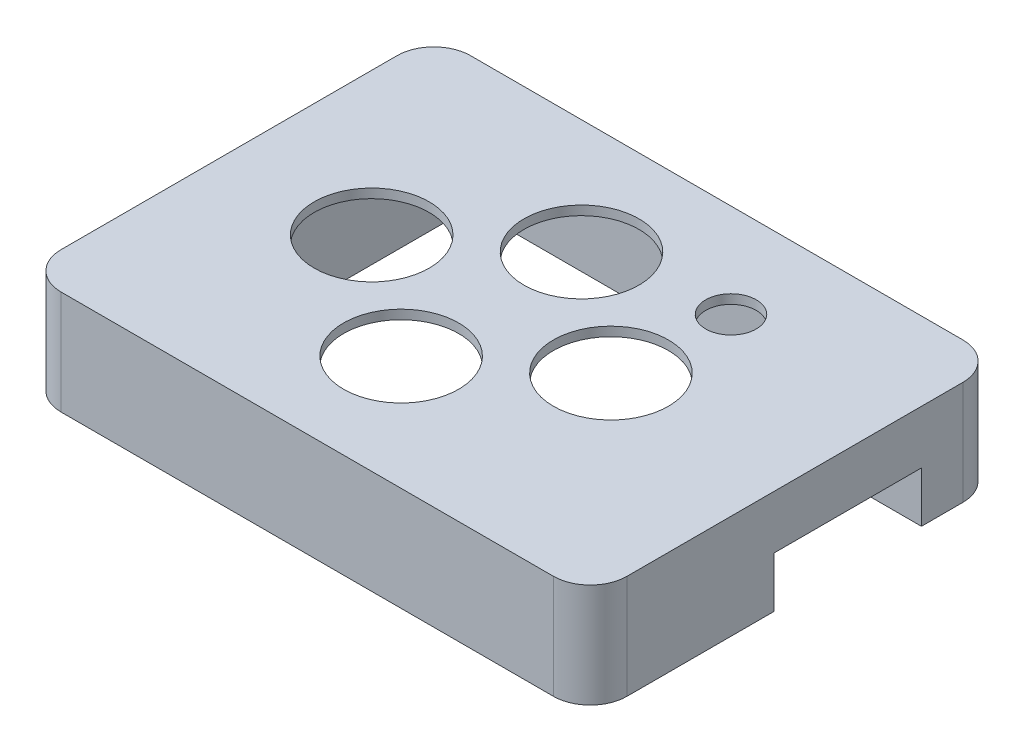
ISO-10303-21;
HEADER;
FILE_DESCRIPTION(('STEP AP214'),'2;1');
FILE_NAME('part.step','',(''),(''),'','','');
FILE_SCHEMA(('AUTOMOTIVE_DESIGN { 1 0 10303 214 1 1 1 1 }'));
ENDSEC;
DATA;
#1=APPLICATION_CONTEXT('core data for automotive mechanical design processes');
#2=APPLICATION_PROTOCOL_DEFINITION('international standard','automotive_design',2000,#1);
#3=PRODUCT_CONTEXT('',#1,'mechanical');
#4=PRODUCT('Part','Part','',(#3));
#5=PRODUCT_RELATED_PRODUCT_CATEGORY('part','',(#4));
#6=PRODUCT_DEFINITION_FORMATION('','',#4);
#7=PRODUCT_DEFINITION_CONTEXT('part definition',#1,'design');
#8=PRODUCT_DEFINITION('design','',#6,#7);
#9=PRODUCT_DEFINITION_SHAPE('','',#8);
#10=(LENGTH_UNIT() NAMED_UNIT(*) SI_UNIT(.MILLI.,.METRE.));
#11=(NAMED_UNIT(*) PLANE_ANGLE_UNIT() SI_UNIT($,.RADIAN.));
#12=(NAMED_UNIT(*) SI_UNIT($,.STERADIAN.) SOLID_ANGLE_UNIT());
#13=UNCERTAINTY_MEASURE_WITH_UNIT(LENGTH_MEASURE(1.E-05),#10,'distance_accuracy_value','');
#14=(GEOMETRIC_REPRESENTATION_CONTEXT(3) GLOBAL_UNCERTAINTY_ASSIGNED_CONTEXT((#13)) GLOBAL_UNIT_ASSIGNED_CONTEXT((#10,
#11,#12)) REPRESENTATION_CONTEXT('',''));
#15=CARTESIAN_POINT('',(0.,0.,0.));
#16=DIRECTION('',(0.,0.,1.));
#17=DIRECTION('',(1.,0.,0.));
#18=AXIS2_PLACEMENT_3D('',#15,#16,#17);
#19=CARTESIAN_POINT('',(0.,1.,0.));
#20=DIRECTION('',(0.,1.,0.));
#21=DIRECTION('',(0.,0.,1.));
#22=AXIS2_PLACEMENT_3D('',#19,#20,#21);
#23=PLANE('',#22);
#24=CARTESIAN_POINT('',(-2.24999999999999,1.,9.8));
#25=DIRECTION('',(0.,1.,0.));
#26=DIRECTION('',(0.,0.,1.));
#27=AXIS2_PLACEMENT_3D('',#24,#25,#26);
#28=CIRCLE('',#27,6.25);
#29=CARTESIAN_POINT('',(-2.24999999999999,1.,16.05));
#30=VERTEX_POINT('',#29);
#31=EDGE_CURVE('E255',#30,#30,#28,.T.);
#32=ORIENTED_EDGE('',*,*,#31,.F.);
#33=EDGE_LOOP('',(#32));
#34=FACE_BOUND('',#33,.T.);
#35=CARTESIAN_POINT('',(10.75,1.,0.));
#36=DIRECTION('',(0.,1.,0.));
#37=DIRECTION('',(0.,0.,1.));
#38=AXIS2_PLACEMENT_3D('',#35,#36,#37);
#39=CIRCLE('',#38,6.25);
#40=CARTESIAN_POINT('',(10.75,1.,6.25));
#41=VERTEX_POINT('',#40);
#42=EDGE_CURVE('E267',#41,#41,#39,.T.);
#43=ORIENTED_EDGE('',*,*,#42,.F.);
#44=EDGE_LOOP('',(#43));
#45=FACE_BOUND('',#44,.T.);
#46=CARTESIAN_POINT('',(-2.24999999999999,1.,-9.8));
#47=DIRECTION('',(0.,1.,0.));
#48=DIRECTION('',(0.,0.,1.));
#49=AXIS2_PLACEMENT_3D('',#46,#47,#48);
#50=CIRCLE('',#49,6.25);
#51=CARTESIAN_POINT('',(-2.24999999999999,1.,-3.55));
#52=VERTEX_POINT('',#51);
#53=EDGE_CURVE('E273',#52,#52,#50,.T.);
#54=ORIENTED_EDGE('',*,*,#53,.F.);
#55=EDGE_LOOP('',(#54));
#56=FACE_BOUND('',#55,.T.);
#57=CARTESIAN_POINT('',(-15.25,1.,0.));
#58=DIRECTION('',(0.,1.,0.));
#59=DIRECTION('',(0.,0.,1.));
#60=AXIS2_PLACEMENT_3D('',#57,#58,#59);
#61=CIRCLE('',#60,6.25);
#62=CARTESIAN_POINT('',(-15.25,1.,6.25));
#63=VERTEX_POINT('',#62);
#64=EDGE_CURVE('E261',#63,#63,#61,.T.);
#65=ORIENTED_EDGE('',*,*,#64,.F.);
#66=EDGE_LOOP('',(#65));
#67=FACE_BOUND('',#66,.T.);
#68=CARTESIAN_POINT('',(11.75,1.,-12.05));
#69=DIRECTION('',(0.,1.,0.));
#70=DIRECTION('',(0.,0.,1.));
#71=AXIS2_PLACEMENT_3D('',#68,#69,#70);
#72=CIRCLE('',#71,2.75);
#73=CARTESIAN_POINT('',(11.75,1.,-9.3));
#74=VERTEX_POINT('',#73);
#75=EDGE_CURVE('E249',#74,#74,#72,.T.);
#76=ORIENTED_EDGE('',*,*,#75,.F.);
#77=EDGE_LOOP('',(#76));
#78=FACE_BOUND('',#77,.T.);
#79=DIRECTION('',(0.,0.,1.));
#80=VECTOR('',#79,1.);
#81=CARTESIAN_POINT('',(-30.75,1.,22.25));
#82=LINE('',#81,#80);
#83=CARTESIAN_POINT('',(-30.75,1.,-18.25));
#84=VERTEX_POINT('',#83);
#85=CARTESIAN_POINT('',(-30.75,1.,18.25));
#86=VERTEX_POINT('',#85);
#87=EDGE_CURVE('E216',#84,#86,#82,.T.);
#88=ORIENTED_EDGE('',*,*,#87,.T.);
#89=CARTESIAN_POINT('',(-26.75,1.,18.25));
#90=DIRECTION('',(0.,1.,0.));
#91=DIRECTION('',(0.,0.,1.));
#92=AXIS2_PLACEMENT_3D('',#89,#90,#91);
#93=CIRCLE('',#92,4.);
#94=CARTESIAN_POINT('',(-26.75,1.,22.25));
#95=VERTEX_POINT('',#94);
#96=EDGE_CURVE('E301',#86,#95,#93,.T.);
#97=ORIENTED_EDGE('',*,*,#96,.T.);
#98=DIRECTION('',(1.,0.,0.));
#99=VECTOR('',#98,1.);
#100=CARTESIAN_POINT('',(30.75,1.,22.25));
#101=LINE('',#100,#99);
#102=CARTESIAN_POINT('',(26.75,1.,22.25));
#103=VERTEX_POINT('',#102);
#104=EDGE_CURVE('E241',#95,#103,#101,.T.);
#105=ORIENTED_EDGE('',*,*,#104,.T.);
#106=CARTESIAN_POINT('',(26.75,1.,18.25));
#107=DIRECTION('',(0.,1.,0.));
#108=DIRECTION('',(0.,0.,1.));
#109=AXIS2_PLACEMENT_3D('',#106,#107,#108);
#110=CIRCLE('',#109,4.);
#111=CARTESIAN_POINT('',(30.75,1.,18.25));
#112=VERTEX_POINT('',#111);
#113=EDGE_CURVE('E295',#103,#112,#110,.T.);
#114=ORIENTED_EDGE('',*,*,#113,.T.);
#115=DIRECTION('',(0.,0.,-1.));
#116=VECTOR('',#115,1.);
#117=CARTESIAN_POINT('',(30.75,1.,22.25));
#118=LINE('',#117,#116);
#119=CARTESIAN_POINT('',(30.75,1.,-18.25));
#120=VERTEX_POINT('',#119);
#121=EDGE_CURVE('E244',#112,#120,#118,.T.);
#122=ORIENTED_EDGE('',*,*,#121,.T.);
#123=CARTESIAN_POINT('',(26.75,1.,-18.25));
#124=DIRECTION('',(0.,1.,0.));
#125=DIRECTION('',(0.,0.,1.));
#126=AXIS2_PLACEMENT_3D('',#123,#124,#125);
#127=CIRCLE('',#126,4.);
#128=CARTESIAN_POINT('',(26.75,1.,-22.25));
#129=VERTEX_POINT('',#128);
#130=EDGE_CURVE('E297',#120,#129,#127,.T.);
#131=ORIENTED_EDGE('',*,*,#130,.T.);
#132=DIRECTION('',(-1.,0.,0.));
#133=VECTOR('',#132,1.);
#134=CARTESIAN_POINT('',(30.75,1.,-22.25));
#135=LINE('',#134,#133);
#136=CARTESIAN_POINT('',(-26.75,1.,-22.25));
#137=VERTEX_POINT('',#136);
#138=EDGE_CURVE('E229',#129,#137,#135,.T.);
#139=ORIENTED_EDGE('',*,*,#138,.T.);
#140=CARTESIAN_POINT('',(-26.75,1.,-18.25));
#141=DIRECTION('',(0.,1.,0.));
#142=DIRECTION('',(0.,0.,1.));
#143=AXIS2_PLACEMENT_3D('',#140,#141,#142);
#144=CIRCLE('',#143,4.);
#145=EDGE_CURVE('E299',#137,#84,#144,.T.);
#146=ORIENTED_EDGE('',*,*,#145,.T.);
#147=EDGE_LOOP('',(#88,#97,#105,#114,#122,#131,#139,#146));
#148=FACE_BOUND('',#147,.T.);
#149=ADVANCED_FACE('F34',(#34,#45,#56,#67,#78,#148),#23,.T.);
#150=CARTESIAN_POINT('',(0.,0.,0.));
#151=DIRECTION('',(0.,1.,0.));
#152=DIRECTION('',(0.,0.,1.));
#153=AXIS2_PLACEMENT_3D('',#150,#151,#152);
#154=PLANE('',#153);
#155=DIRECTION('',(0.,0.,1.));
#156=VECTOR('',#155,1.);
#157=CARTESIAN_POINT('',(-23.75,0.,19.25));
#158=LINE('',#157,#156);
#159=CARTESIAN_POINT('',(-23.75,0.,-19.25));
#160=VERTEX_POINT('',#159);
#161=CARTESIAN_POINT('',(-23.75,0.,19.25));
#162=VERTEX_POINT('',#161);
#163=EDGE_CURVE('E276',#160,#162,#158,.T.);
#164=ORIENTED_EDGE('',*,*,#163,.F.);
#165=DIRECTION('',(-1.,0.,0.));
#166=VECTOR('',#165,1.);
#167=CARTESIAN_POINT('',(23.75,0.,-19.25));
#168=LINE('',#167,#166);
#169=CARTESIAN_POINT('',(23.75,0.,-19.25));
#170=VERTEX_POINT('',#169);
#171=EDGE_CURVE('E287',#170,#160,#168,.T.);
#172=ORIENTED_EDGE('',*,*,#171,.F.);
#173=DIRECTION('',(0.,0.,-1.));
#174=VECTOR('',#173,1.);
#175=CARTESIAN_POINT('',(23.75,0.,19.25));
#176=LINE('',#175,#174);
#177=CARTESIAN_POINT('',(23.75,0.,19.25));
#178=VERTEX_POINT('',#177);
#179=EDGE_CURVE('E284',#178,#170,#176,.T.);
#180=ORIENTED_EDGE('',*,*,#179,.F.);
#181=DIRECTION('',(1.,0.,0.));
#182=VECTOR('',#181,1.);
#183=CARTESIAN_POINT('',(23.75,0.,19.25));
#184=LINE('',#183,#182);
#185=EDGE_CURVE('E281',#162,#178,#184,.T.);
#186=ORIENTED_EDGE('',*,*,#185,.F.);
#187=EDGE_LOOP('',(#164,#172,#180,#186));
#188=FACE_BOUND('',#187,.T.);
#189=CARTESIAN_POINT('',(-2.24999999999999,0.,-9.8));
#190=DIRECTION('',(0.,1.,0.));
#191=DIRECTION('',(0.,0.,1.));
#192=AXIS2_PLACEMENT_3D('',#189,#190,#191);
#193=CIRCLE('',#192,6.25);
#194=CARTESIAN_POINT('',(-2.24999999999999,0.,-3.55));
#195=VERTEX_POINT('',#194);
#196=EDGE_CURVE('E270',#195,#195,#193,.T.);
#197=ORIENTED_EDGE('',*,*,#196,.T.);
#198=EDGE_LOOP('',(#197));
#199=FACE_BOUND('',#198,.T.);
#200=CARTESIAN_POINT('',(10.75,0.,0.));
#201=DIRECTION('',(0.,1.,0.));
#202=DIRECTION('',(0.,0.,1.));
#203=AXIS2_PLACEMENT_3D('',#200,#201,#202);
#204=CIRCLE('',#203,6.25);
#205=CARTESIAN_POINT('',(10.75,0.,6.25));
#206=VERTEX_POINT('',#205);
#207=EDGE_CURVE('E264',#206,#206,#204,.T.);
#208=ORIENTED_EDGE('',*,*,#207,.T.);
#209=EDGE_LOOP('',(#208));
#210=FACE_BOUND('',#209,.T.);
#211=CARTESIAN_POINT('',(-15.25,0.,0.));
#212=DIRECTION('',(0.,1.,0.));
#213=DIRECTION('',(0.,0.,1.));
#214=AXIS2_PLACEMENT_3D('',#211,#212,#213);
#215=CIRCLE('',#214,6.25);
#216=CARTESIAN_POINT('',(-15.25,0.,6.25));
#217=VERTEX_POINT('',#216);
#218=EDGE_CURVE('E258',#217,#217,#215,.T.);
#219=ORIENTED_EDGE('',*,*,#218,.T.);
#220=EDGE_LOOP('',(#219));
#221=FACE_BOUND('',#220,.T.);
#222=CARTESIAN_POINT('',(-2.24999999999999,0.,9.8));
#223=DIRECTION('',(0.,1.,0.));
#224=DIRECTION('',(0.,0.,1.));
#225=AXIS2_PLACEMENT_3D('',#222,#223,#224);
#226=CIRCLE('',#225,6.25);
#227=CARTESIAN_POINT('',(-2.24999999999999,0.,16.05));
#228=VERTEX_POINT('',#227);
#229=EDGE_CURVE('E252',#228,#228,#226,.T.);
#230=ORIENTED_EDGE('',*,*,#229,.T.);
#231=EDGE_LOOP('',(#230));
#232=FACE_BOUND('',#231,.T.);
#233=CARTESIAN_POINT('',(11.75,0.,-12.05));
#234=DIRECTION('',(0.,1.,0.));
#235=DIRECTION('',(0.,0.,1.));
#236=AXIS2_PLACEMENT_3D('',#233,#234,#235);
#237=CIRCLE('',#236,2.75);
#238=CARTESIAN_POINT('',(11.75,0.,-9.3));
#239=VERTEX_POINT('',#238);
#240=EDGE_CURVE('E238',#239,#239,#237,.T.);
#241=ORIENTED_EDGE('',*,*,#240,.T.);
#242=EDGE_LOOP('',(#241));
#243=FACE_BOUND('',#242,.T.);
#244=ADVANCED_FACE('F374',(#188,#199,#210,#221,#232,#243),#154,.F.);
#245=CARTESIAN_POINT('',(-2.24999999999999,1.,-9.8));
#246=DIRECTION('',(0.,-1.,0.));
#247=DIRECTION('',(0.,0.,-1.));
#248=AXIS2_PLACEMENT_3D('',#245,#246,#247);
#249=CYLINDRICAL_SURFACE('',#248,6.25);
#250=ORIENTED_EDGE('',*,*,#53,.T.);
#251=EDGE_LOOP('',(#250));
#252=FACE_BOUND('',#251,.T.);
#253=ORIENTED_EDGE('',*,*,#196,.F.);
#254=EDGE_LOOP('',(#253));
#255=FACE_BOUND('',#254,.T.);
#256=ADVANCED_FACE('F377',(#252,#255),#249,.F.);
#257=CARTESIAN_POINT('',(10.75,1.,0.));
#258=DIRECTION('',(0.,-1.,0.));
#259=DIRECTION('',(0.,0.,-1.));
#260=AXIS2_PLACEMENT_3D('',#257,#258,#259);
#261=CYLINDRICAL_SURFACE('',#260,6.25);
#262=ORIENTED_EDGE('',*,*,#42,.T.);
#263=EDGE_LOOP('',(#262));
#264=FACE_BOUND('',#263,.T.);
#265=ORIENTED_EDGE('',*,*,#207,.F.);
#266=EDGE_LOOP('',(#265));
#267=FACE_BOUND('',#266,.T.);
#268=ADVANCED_FACE('F643',(#264,#267),#261,.F.);
#269=CARTESIAN_POINT('',(-15.25,1.,0.));
#270=DIRECTION('',(0.,-1.,0.));
#271=DIRECTION('',(0.,0.,-1.));
#272=AXIS2_PLACEMENT_3D('',#269,#270,#271);
#273=CYLINDRICAL_SURFACE('',#272,6.25);
#274=ORIENTED_EDGE('',*,*,#64,.T.);
#275=EDGE_LOOP('',(#274));
#276=FACE_BOUND('',#275,.T.);
#277=ORIENTED_EDGE('',*,*,#218,.F.);
#278=EDGE_LOOP('',(#277));
#279=FACE_BOUND('',#278,.T.);
#280=ADVANCED_FACE('F399',(#276,#279),#273,.F.);
#281=CARTESIAN_POINT('',(-2.24999999999999,1.,9.8));
#282=DIRECTION('',(0.,-1.,0.));
#283=DIRECTION('',(0.,0.,-1.));
#284=AXIS2_PLACEMENT_3D('',#281,#282,#283);
#285=CYLINDRICAL_SURFACE('',#284,6.25);
#286=ORIENTED_EDGE('',*,*,#31,.T.);
#287=EDGE_LOOP('',(#286));
#288=FACE_BOUND('',#287,.T.);
#289=ORIENTED_EDGE('',*,*,#229,.F.);
#290=EDGE_LOOP('',(#289));
#291=FACE_BOUND('',#290,.T.);
#292=ADVANCED_FACE('F391',(#288,#291),#285,.F.);
#293=CARTESIAN_POINT('',(11.75,1.,-12.05));
#294=DIRECTION('',(0.,-1.,0.));
#295=DIRECTION('',(0.,0.,-1.));
#296=AXIS2_PLACEMENT_3D('',#293,#294,#295);
#297=CYLINDRICAL_SURFACE('',#296,2.75);
#298=ORIENTED_EDGE('',*,*,#75,.T.);
#299=EDGE_LOOP('',(#298));
#300=FACE_BOUND('',#299,.T.);
#301=ORIENTED_EDGE('',*,*,#240,.F.);
#302=EDGE_LOOP('',(#301));
#303=FACE_BOUND('',#302,.T.);
#304=ADVANCED_FACE('F389',(#300,#303),#297,.F.);
#305=CARTESIAN_POINT('',(23.75,-10.3,-19.25));
#306=DIRECTION('',(0.,0.,-1.));
#307=DIRECTION('',(-1.,0.,0.));
#308=AXIS2_PLACEMENT_3D('',#305,#306,#307);
#309=PLANE('',#308);
#310=DIRECTION('',(0.,1.,0.));
#311=VECTOR('',#310,1.);
#312=CARTESIAN_POINT('',(23.75,-10.3,-19.25));
#313=LINE('',#312,#311);
#314=CARTESIAN_POINT('',(23.75,-10.3,-19.25));
#315=VERTEX_POINT('',#314);
#316=EDGE_CURVE('E217',#315,#170,#313,.T.);
#317=ORIENTED_EDGE('',*,*,#316,.T.);
#318=ORIENTED_EDGE('',*,*,#171,.T.);
#319=DIRECTION('',(0.,1.,0.));
#320=VECTOR('',#319,1.);
#321=CARTESIAN_POINT('',(-23.75,-10.3,-19.25));
#322=LINE('',#321,#320);
#323=CARTESIAN_POINT('',(-23.75,-10.3,-19.25));
#324=VERTEX_POINT('',#323);
#325=EDGE_CURVE('E213',#324,#160,#322,.T.);
#326=ORIENTED_EDGE('',*,*,#325,.F.);
#327=DIRECTION('',(-1.,0.,0.));
#328=VECTOR('',#327,1.);
#329=CARTESIAN_POINT('',(23.75,-10.3,-19.25));
#330=LINE('',#329,#328);
#331=EDGE_CURVE('E209',#315,#324,#330,.T.);
#332=ORIENTED_EDGE('',*,*,#331,.F.);
#333=EDGE_LOOP('',(#317,#318,#326,#332));
#334=FACE_BOUND('',#333,.T.);
#335=ADVANCED_FACE('F365',(#334),#309,.F.);
#336=CARTESIAN_POINT('',(23.75,-10.3,19.25));
#337=DIRECTION('',(0.,0.,1.));
#338=DIRECTION('',(1.,0.,0.));
#339=AXIS2_PLACEMENT_3D('',#336,#337,#338);
#340=PLANE('',#339);
#341=DIRECTION('',(0.,1.,0.));
#342=VECTOR('',#341,1.);
#343=CARTESIAN_POINT('',(-23.75,-10.3,19.25));
#344=LINE('',#343,#342);
#345=CARTESIAN_POINT('',(-23.75,-10.3,19.25));
#346=VERTEX_POINT('',#345);
#347=EDGE_CURVE('E212',#346,#162,#344,.T.);
#348=ORIENTED_EDGE('',*,*,#347,.T.);
#349=ORIENTED_EDGE('',*,*,#185,.T.);
#350=DIRECTION('',(0.,1.,0.));
#351=VECTOR('',#350,1.);
#352=CARTESIAN_POINT('',(23.75,-10.3,19.25));
#353=LINE('',#352,#351);
#354=CARTESIAN_POINT('',(23.75,-10.3,19.25));
#355=VERTEX_POINT('',#354);
#356=EDGE_CURVE('E220',#355,#178,#353,.T.);
#357=ORIENTED_EDGE('',*,*,#356,.F.);
#358=DIRECTION('',(1.,0.,0.));
#359=VECTOR('',#358,1.);
#360=CARTESIAN_POINT('',(23.75,-10.3,19.25));
#361=LINE('',#360,#359);
#362=EDGE_CURVE('E203',#346,#355,#361,.T.);
#363=ORIENTED_EDGE('',*,*,#362,.F.);
#364=EDGE_LOOP('',(#348,#349,#357,#363));
#365=FACE_BOUND('',#364,.T.);
#366=ADVANCED_FACE('F372',(#365),#340,.F.);
#367=CARTESIAN_POINT('',(-23.75,-10.3,19.25));
#368=DIRECTION('',(-1.,0.,0.));
#369=DIRECTION('',(0.,0.,1.));
#370=AXIS2_PLACEMENT_3D('',#367,#368,#369);
#371=PLANE('',#370);
#372=ORIENTED_EDGE('',*,*,#325,.T.);
#373=ORIENTED_EDGE('',*,*,#163,.T.);
#374=ORIENTED_EDGE('',*,*,#347,.F.);
#375=DIRECTION('',(0.,0.,1.));
#376=VECTOR('',#375,1.);
#377=CARTESIAN_POINT('',(-23.75,-10.3,19.25));
#378=LINE('',#377,#376);
#379=EDGE_CURVE('E200',#324,#346,#378,.T.);
#380=ORIENTED_EDGE('',*,*,#379,.F.);
#381=EDGE_LOOP('',(#372,#373,#374,#380));
#382=FACE_BOUND('',#381,.T.);
#383=ADVANCED_FACE('F369',(#382),#371,.F.);
#384=CARTESIAN_POINT('',(23.75,-10.3,19.25));
#385=DIRECTION('',(1.,0.,0.));
#386=DIRECTION('',(0.,0.,-1.));
#387=AXIS2_PLACEMENT_3D('',#384,#385,#386);
#388=PLANE('',#387);
#389=DIRECTION('',(0.,0.,-1.));
#390=VECTOR('',#389,1.);
#391=CARTESIAN_POINT('',(23.75,-4.8,2.25));
#392=LINE('',#391,#390);
#393=CARTESIAN_POINT('',(23.75,-4.8,2.25));
#394=VERTEX_POINT('',#393);
#395=CARTESIAN_POINT('',(23.75,-4.8,-13.75));
#396=VERTEX_POINT('',#395);
#397=EDGE_CURVE('E153',#394,#396,#392,.T.);
#398=ORIENTED_EDGE('',*,*,#397,.F.);
#399=DIRECTION('',(0.,1.,0.));
#400=VECTOR('',#399,1.);
#401=CARTESIAN_POINT('',(23.75,-10.3,2.25));
#402=LINE('',#401,#400);
#403=CARTESIAN_POINT('',(23.75,-10.3,2.25));
#404=VERTEX_POINT('',#403);
#405=EDGE_CURVE('E160',#404,#394,#402,.T.);
#406=ORIENTED_EDGE('',*,*,#405,.F.);
#407=DIRECTION('',(0.,0.,-1.));
#408=VECTOR('',#407,1.);
#409=CARTESIAN_POINT('',(23.75,-10.3,19.25));
#410=LINE('',#409,#408);
#411=EDGE_CURVE('E207',#355,#404,#410,.T.);
#412=ORIENTED_EDGE('',*,*,#411,.F.);
#413=ORIENTED_EDGE('',*,*,#356,.T.);
#414=ORIENTED_EDGE('',*,*,#179,.T.);
#415=ORIENTED_EDGE('',*,*,#316,.F.);
#416=CARTESIAN_POINT('',(23.75,-10.3,-13.75));
#417=VERTEX_POINT('',#416);
#418=EDGE_CURVE('E206',#417,#315,#410,.T.);
#419=ORIENTED_EDGE('',*,*,#418,.F.);
#420=DIRECTION('',(0.,-1.,0.));
#421=VECTOR('',#420,1.);
#422=CARTESIAN_POINT('',(23.75,-10.3,-13.75));
#423=LINE('',#422,#421);
#424=EDGE_CURVE('E49',#396,#417,#423,.T.);
#425=ORIENTED_EDGE('',*,*,#424,.F.);
#426=EDGE_LOOP('',(#398,#406,#412,#413,#414,#415,#419,#425));
#427=FACE_BOUND('',#426,.T.);
#428=ADVANCED_FACE('F166',(#427),#388,.F.);
#429=CARTESIAN_POINT('',(-30.75,-10.3,22.25));
#430=DIRECTION('',(-1.,0.,0.));
#431=DIRECTION('',(0.,0.,1.));
#432=AXIS2_PLACEMENT_3D('',#429,#430,#431);
#433=PLANE('',#432);
#434=DIRECTION('',(0.,0.,1.));
#435=VECTOR('',#434,1.);
#436=CARTESIAN_POINT('',(-30.75,-10.3,22.25));
#437=LINE('',#436,#435);
#438=CARTESIAN_POINT('',(-30.75,-10.3,-18.25));
#439=VERTEX_POINT('',#438);
#440=CARTESIAN_POINT('',(-30.75,-10.3,18.25));
#441=VERTEX_POINT('',#440);
#442=EDGE_CURVE('E225',#439,#441,#437,.T.);
#443=ORIENTED_EDGE('',*,*,#442,.T.);
#444=DIRECTION('',(0.,1.,0.));
#445=VECTOR('',#444,1.);
#446=CARTESIAN_POINT('',(-30.75,-10.3,18.25));
#447=LINE('',#446,#445);
#448=EDGE_CURVE('E292',#441,#86,#447,.T.);
#449=ORIENTED_EDGE('',*,*,#448,.T.);
#450=ORIENTED_EDGE('',*,*,#87,.F.);
#451=DIRECTION('',(0.,1.,0.));
#452=VECTOR('',#451,1.);
#453=CARTESIAN_POINT('',(-30.75,-10.3,-18.25));
#454=LINE('',#453,#452);
#455=EDGE_CURVE('E290',#84,#439,#454,.F.);
#456=ORIENTED_EDGE('',*,*,#455,.T.);
#457=EDGE_LOOP('',(#443,#449,#450,#456));
#458=FACE_BOUND('',#457,.T.);
#459=ADVANCED_FACE('F347',(#458),#433,.T.);
#460=CARTESIAN_POINT('',(30.75,-10.3,-22.25));
#461=DIRECTION('',(0.,0.,-1.));
#462=DIRECTION('',(-1.,0.,0.));
#463=AXIS2_PLACEMENT_3D('',#460,#461,#462);
#464=PLANE('',#463);
#465=DIRECTION('',(-1.,0.,0.));
#466=VECTOR('',#465,1.);
#467=CARTESIAN_POINT('',(30.75,-10.3,-22.25));
#468=LINE('',#467,#466);
#469=CARTESIAN_POINT('',(26.75,-10.3,-22.25));
#470=VERTEX_POINT('',#469);
#471=CARTESIAN_POINT('',(-26.75,-10.3,-22.25));
#472=VERTEX_POINT('',#471);
#473=EDGE_CURVE('E235',#470,#472,#468,.T.);
#474=ORIENTED_EDGE('',*,*,#473,.T.);
#475=DIRECTION('',(0.,1.,0.));
#476=VECTOR('',#475,1.);
#477=CARTESIAN_POINT('',(-26.75,-10.3,-22.25));
#478=LINE('',#477,#476);
#479=EDGE_CURVE('E318',#472,#137,#478,.T.);
#480=ORIENTED_EDGE('',*,*,#479,.T.);
#481=ORIENTED_EDGE('',*,*,#138,.F.);
#482=DIRECTION('',(0.,1.,0.));
#483=VECTOR('',#482,1.);
#484=CARTESIAN_POINT('',(26.75,-10.3,-22.25));
#485=LINE('',#484,#483);
#486=EDGE_CURVE('E316',#129,#470,#485,.F.);
#487=ORIENTED_EDGE('',*,*,#486,.T.);
#488=EDGE_LOOP('',(#474,#480,#481,#487));
#489=FACE_BOUND('',#488,.T.);
#490=ADVANCED_FACE('F356',(#489),#464,.T.);
#491=CARTESIAN_POINT('',(30.75,-10.3,22.25));
#492=DIRECTION('',(1.,0.,0.));
#493=DIRECTION('',(0.,0.,-1.));
#494=AXIS2_PLACEMENT_3D('',#491,#492,#493);
#495=PLANE('',#494);
#496=DIRECTION('',(0.,-1.,0.));
#497=VECTOR('',#496,1.);
#498=CARTESIAN_POINT('',(30.75,-10.3,2.25));
#499=LINE('',#498,#497);
#500=CARTESIAN_POINT('',(30.75,-4.8,2.25));
#501=VERTEX_POINT('',#500);
#502=CARTESIAN_POINT('',(30.75,-10.3,2.25));
#503=VERTEX_POINT('',#502);
#504=EDGE_CURVE('E174',#501,#503,#499,.T.);
#505=ORIENTED_EDGE('',*,*,#504,.F.);
#506=DIRECTION('',(0.,0.,1.));
#507=VECTOR('',#506,1.);
#508=CARTESIAN_POINT('',(30.75,-4.8,22.25));
#509=LINE('',#508,#507);
#510=CARTESIAN_POINT('',(30.75,-4.8,-13.75));
#511=VERTEX_POINT('',#510);
#512=EDGE_CURVE('E11',#511,#501,#509,.T.);
#513=ORIENTED_EDGE('',*,*,#512,.F.);
#514=DIRECTION('',(0.,1.,0.));
#515=VECTOR('',#514,1.);
#516=CARTESIAN_POINT('',(30.75,-10.3,-13.75));
#517=LINE('',#516,#515);
#518=CARTESIAN_POINT('',(30.75,-10.3,-13.75));
#519=VERTEX_POINT('',#518);
#520=EDGE_CURVE('E171',#519,#511,#517,.T.);
#521=ORIENTED_EDGE('',*,*,#520,.F.);
#522=DIRECTION('',(0.,0.,-1.));
#523=VECTOR('',#522,1.);
#524=CARTESIAN_POINT('',(30.75,-10.3,22.25));
#525=LINE('',#524,#523);
#526=CARTESIAN_POINT('',(30.75,-10.3,-18.25));
#527=VERTEX_POINT('',#526);
#528=EDGE_CURVE('E57',#519,#527,#525,.T.);
#529=ORIENTED_EDGE('',*,*,#528,.T.);
#530=DIRECTION('',(0.,1.,0.));
#531=VECTOR('',#530,1.);
#532=CARTESIAN_POINT('',(30.75,-10.3,-18.25));
#533=LINE('',#532,#531);
#534=EDGE_CURVE('E323',#527,#120,#533,.T.);
#535=ORIENTED_EDGE('',*,*,#534,.T.);
#536=ORIENTED_EDGE('',*,*,#121,.F.);
#537=DIRECTION('',(0.,1.,0.));
#538=VECTOR('',#537,1.);
#539=CARTESIAN_POINT('',(30.75,-10.3,18.25));
#540=LINE('',#539,#538);
#541=CARTESIAN_POINT('',(30.75,-10.3,18.25));
#542=VERTEX_POINT('',#541);
#543=EDGE_CURVE('E321',#112,#542,#540,.F.);
#544=ORIENTED_EDGE('',*,*,#543,.T.);
#545=EDGE_CURVE('E232',#542,#503,#525,.T.);
#546=ORIENTED_EDGE('',*,*,#545,.T.);
#547=EDGE_LOOP('',(#505,#513,#521,#529,#535,#536,#544,#546));
#548=FACE_BOUND('',#547,.T.);
#549=ADVANCED_FACE('F330',(#548),#495,.T.);
#550=CARTESIAN_POINT('',(30.75,-10.3,22.25));
#551=DIRECTION('',(0.,0.,1.));
#552=DIRECTION('',(1.,0.,0.));
#553=AXIS2_PLACEMENT_3D('',#550,#551,#552);
#554=PLANE('',#553);
#555=ORIENTED_EDGE('',*,*,#104,.F.);
#556=DIRECTION('',(0.,1.,0.));
#557=VECTOR('',#556,1.);
#558=CARTESIAN_POINT('',(-26.75,-10.3,22.25));
#559=LINE('',#558,#557);
#560=CARTESIAN_POINT('',(-26.75,-10.3,22.25));
#561=VERTEX_POINT('',#560);
#562=EDGE_CURVE('E306',#95,#561,#559,.F.);
#563=ORIENTED_EDGE('',*,*,#562,.T.);
#564=DIRECTION('',(1.,0.,0.));
#565=VECTOR('',#564,1.);
#566=CARTESIAN_POINT('',(30.75,-10.3,22.25));
#567=LINE('',#566,#565);
#568=CARTESIAN_POINT('',(26.75,-10.3,22.25));
#569=VERTEX_POINT('',#568);
#570=EDGE_CURVE('E228',#561,#569,#567,.T.);
#571=ORIENTED_EDGE('',*,*,#570,.T.);
#572=DIRECTION('',(0.,1.,0.));
#573=VECTOR('',#572,1.);
#574=CARTESIAN_POINT('',(26.75,-10.3,22.25));
#575=LINE('',#574,#573);
#576=EDGE_CURVE('E303',#569,#103,#575,.T.);
#577=ORIENTED_EDGE('',*,*,#576,.T.);
#578=EDGE_LOOP('',(#555,#563,#571,#577));
#579=FACE_BOUND('',#578,.T.);
#580=ADVANCED_FACE('F339',(#579),#554,.T.);
#581=CARTESIAN_POINT('',(0.,-10.3,0.));
#582=DIRECTION('',(0.,1.,0.));
#583=DIRECTION('',(0.,0.,1.));
#584=AXIS2_PLACEMENT_3D('',#581,#582,#583);
#585=PLANE('',#584);
#586=CARTESIAN_POINT('',(-27.25,-10.3,18.75));
#587=DIRECTION('',(0.,1.,0.));
#588=DIRECTION('',(0.,0.,-1.));
#589=AXIS2_PLACEMENT_3D('',#586,#587,#588);
#590=CIRCLE('',#589,1.55);
#591=CARTESIAN_POINT('',(-27.25,-10.3,17.2));
#592=VERTEX_POINT('',#591);
#593=EDGE_CURVE('E188',#592,#592,#590,.T.);
#594=ORIENTED_EDGE('',*,*,#593,.T.);
#595=EDGE_LOOP('',(#594));
#596=FACE_BOUND('',#595,.T.);
#597=CARTESIAN_POINT('',(27.25,-10.3,18.75));
#598=DIRECTION('',(0.,1.,0.));
#599=DIRECTION('',(0.,0.,1.));
#600=AXIS2_PLACEMENT_3D('',#597,#598,#599);
#601=CIRCLE('',#600,1.55);
#602=CARTESIAN_POINT('',(27.25,-10.3,20.3));
#603=VERTEX_POINT('',#602);
#604=EDGE_CURVE('E191',#603,#603,#601,.T.);
#605=ORIENTED_EDGE('',*,*,#604,.T.);
#606=EDGE_LOOP('',(#605));
#607=FACE_BOUND('',#606,.T.);
#608=CARTESIAN_POINT('',(27.25,-10.3,-18.75));
#609=DIRECTION('',(0.,1.,0.));
#610=DIRECTION('',(0.,0.,-1.));
#611=AXIS2_PLACEMENT_3D('',#608,#609,#610);
#612=CIRCLE('',#611,1.55);
#613=CARTESIAN_POINT('',(27.25,-10.3,-20.3));
#614=VERTEX_POINT('',#613);
#615=EDGE_CURVE('E194',#614,#614,#612,.T.);
#616=ORIENTED_EDGE('',*,*,#615,.T.);
#617=EDGE_LOOP('',(#616));
#618=FACE_BOUND('',#617,.T.);
#619=CARTESIAN_POINT('',(-27.25,-10.3,-18.75));
#620=DIRECTION('',(0.,1.,0.));
#621=DIRECTION('',(0.,0.,1.));
#622=AXIS2_PLACEMENT_3D('',#619,#620,#621);
#623=CIRCLE('',#622,1.55);
#624=CARTESIAN_POINT('',(-27.25,-10.3,-17.2));
#625=VERTEX_POINT('',#624);
#626=EDGE_CURVE('E197',#625,#625,#623,.T.);
#627=ORIENTED_EDGE('',*,*,#626,.T.);
#628=EDGE_LOOP('',(#627));
#629=FACE_BOUND('',#628,.T.);
#630=ORIENTED_EDGE('',*,*,#411,.T.);
#631=DIRECTION('',(1.,0.,0.));
#632=VECTOR('',#631,1.);
#633=CARTESIAN_POINT('',(0.,-10.3,2.25));
#634=LINE('',#633,#632);
#635=EDGE_CURVE('E42',#404,#503,#634,.T.);
#636=ORIENTED_EDGE('',*,*,#635,.T.);
#637=ORIENTED_EDGE('',*,*,#545,.F.);
#638=CARTESIAN_POINT('',(26.75,-10.3,18.25));
#639=DIRECTION('',(0.,1.,0.));
#640=DIRECTION('',(0.,0.,1.));
#641=AXIS2_PLACEMENT_3D('',#638,#639,#640);
#642=CIRCLE('',#641,4.);
#643=EDGE_CURVE('E308',#542,#569,#642,.F.);
#644=ORIENTED_EDGE('',*,*,#643,.T.);
#645=ORIENTED_EDGE('',*,*,#570,.F.);
#646=CARTESIAN_POINT('',(-26.75,-10.3,18.25));
#647=DIRECTION('',(0.,1.,0.));
#648=DIRECTION('',(0.,0.,1.));
#649=AXIS2_PLACEMENT_3D('',#646,#647,#648);
#650=CIRCLE('',#649,4.);
#651=EDGE_CURVE('E314',#561,#441,#650,.F.);
#652=ORIENTED_EDGE('',*,*,#651,.T.);
#653=ORIENTED_EDGE('',*,*,#442,.F.);
#654=CARTESIAN_POINT('',(-26.75,-10.3,-18.25));
#655=DIRECTION('',(0.,1.,0.));
#656=DIRECTION('',(0.,0.,1.));
#657=AXIS2_PLACEMENT_3D('',#654,#655,#656);
#658=CIRCLE('',#657,4.);
#659=EDGE_CURVE('E312',#439,#472,#658,.F.);
#660=ORIENTED_EDGE('',*,*,#659,.T.);
#661=ORIENTED_EDGE('',*,*,#473,.F.);
#662=CARTESIAN_POINT('',(26.75,-10.3,-18.25));
#663=DIRECTION('',(0.,1.,0.));
#664=DIRECTION('',(0.,0.,1.));
#665=AXIS2_PLACEMENT_3D('',#662,#663,#664);
#666=CIRCLE('',#665,4.);
#667=EDGE_CURVE('E310',#470,#527,#666,.F.);
#668=ORIENTED_EDGE('',*,*,#667,.T.);
#669=ORIENTED_EDGE('',*,*,#528,.F.);
#670=DIRECTION('',(-1.,0.,0.));
#671=VECTOR('',#670,1.);
#672=CARTESIAN_POINT('',(0.,-10.3,-13.75));
#673=LINE('',#672,#671);
#674=EDGE_CURVE('E325',#519,#417,#673,.T.);
#675=ORIENTED_EDGE('',*,*,#674,.T.);
#676=ORIENTED_EDGE('',*,*,#418,.T.);
#677=ORIENTED_EDGE('',*,*,#331,.T.);
#678=ORIENTED_EDGE('',*,*,#379,.T.);
#679=ORIENTED_EDGE('',*,*,#362,.T.);
#680=EDGE_LOOP('',(#630,#636,#637,#644,#645,#652,#653,#660,#661,#668,#669,#675,#676,#677,#678,#679));
#681=FACE_BOUND('',#680,.T.);
#682=ADVANCED_FACE('F328',(#596,#607,#618,#629,#681),#585,.F.);
#683=CARTESIAN_POINT('',(-27.25,-10.3,-18.75));
#684=DIRECTION('',(0.,1.,0.));
#685=DIRECTION('',(0.,0.,1.));
#686=AXIS2_PLACEMENT_3D('',#683,#684,#685);
#687=CYLINDRICAL_SURFACE('',#686,1.55);
#688=CARTESIAN_POINT('',(-27.25,-1.,-18.75));
#689=DIRECTION('',(0.,-1.,0.));
#690=DIRECTION('',(0.,0.,-1.));
#691=AXIS2_PLACEMENT_3D('',#688,#689,#690);
#692=CIRCLE('',#691,1.55);
#693=CARTESIAN_POINT('',(-27.25,-1.,-20.3));
#694=VERTEX_POINT('',#693);
#695=EDGE_CURVE('E176',#694,#694,#692,.T.);
#696=ORIENTED_EDGE('',*,*,#695,.F.);
#697=EDGE_LOOP('',(#696));
#698=FACE_BOUND('',#697,.T.);
#699=ORIENTED_EDGE('',*,*,#626,.F.);
#700=EDGE_LOOP('',(#699));
#701=FACE_BOUND('',#700,.T.);
#702=ADVANCED_FACE('F458',(#698,#701),#687,.F.);
#703=CARTESIAN_POINT('',(27.25,-10.3,-18.75));
#704=DIRECTION('',(0.,1.,0.));
#705=DIRECTION('',(0.,0.,1.));
#706=AXIS2_PLACEMENT_3D('',#703,#704,#705);
#707=CYLINDRICAL_SURFACE('',#706,1.55);
#708=CARTESIAN_POINT('',(27.25,-1.,-18.75));
#709=DIRECTION('',(0.,-1.,0.));
#710=DIRECTION('',(0.,0.,-1.));
#711=AXIS2_PLACEMENT_3D('',#708,#709,#710);
#712=CIRCLE('',#711,1.55);
#713=CARTESIAN_POINT('',(27.25,-1.,-20.3));
#714=VERTEX_POINT('',#713);
#715=EDGE_CURVE('E185',#714,#714,#712,.T.);
#716=ORIENTED_EDGE('',*,*,#715,.F.);
#717=EDGE_LOOP('',(#716));
#718=FACE_BOUND('',#717,.T.);
#719=ORIENTED_EDGE('',*,*,#615,.F.);
#720=EDGE_LOOP('',(#719));
#721=FACE_BOUND('',#720,.T.);
#722=ADVANCED_FACE('F454',(#718,#721),#707,.F.);
#723=CARTESIAN_POINT('',(27.25,-10.3,18.75));
#724=DIRECTION('',(0.,1.,0.));
#725=DIRECTION('',(0.,0.,1.));
#726=AXIS2_PLACEMENT_3D('',#723,#724,#725);
#727=CYLINDRICAL_SURFACE('',#726,1.55);
#728=CARTESIAN_POINT('',(27.25,-1.,18.75));
#729=DIRECTION('',(0.,-1.,0.));
#730=DIRECTION('',(0.,0.,-1.));
#731=AXIS2_PLACEMENT_3D('',#728,#729,#730);
#732=CIRCLE('',#731,1.55);
#733=CARTESIAN_POINT('',(27.25,-1.,17.2));
#734=VERTEX_POINT('',#733);
#735=EDGE_CURVE('E182',#734,#734,#732,.T.);
#736=ORIENTED_EDGE('',*,*,#735,.F.);
#737=EDGE_LOOP('',(#736));
#738=FACE_BOUND('',#737,.T.);
#739=ORIENTED_EDGE('',*,*,#604,.F.);
#740=EDGE_LOOP('',(#739));
#741=FACE_BOUND('',#740,.T.);
#742=ADVANCED_FACE('F450',(#738,#741),#727,.F.);
#743=CARTESIAN_POINT('',(-27.25,-10.3,18.75));
#744=DIRECTION('',(0.,1.,0.));
#745=DIRECTION('',(0.,0.,1.));
#746=AXIS2_PLACEMENT_3D('',#743,#744,#745);
#747=CYLINDRICAL_SURFACE('',#746,1.55);
#748=CARTESIAN_POINT('',(-27.25,-1.,18.75));
#749=DIRECTION('',(0.,-1.,0.));
#750=DIRECTION('',(0.,0.,-1.));
#751=AXIS2_PLACEMENT_3D('',#748,#749,#750);
#752=CIRCLE('',#751,1.55);
#753=CARTESIAN_POINT('',(-27.25,-1.,17.2));
#754=VERTEX_POINT('',#753);
#755=EDGE_CURVE('E179',#754,#754,#752,.T.);
#756=ORIENTED_EDGE('',*,*,#755,.F.);
#757=EDGE_LOOP('',(#756));
#758=FACE_BOUND('',#757,.T.);
#759=ORIENTED_EDGE('',*,*,#593,.F.);
#760=EDGE_LOOP('',(#759));
#761=FACE_BOUND('',#760,.T.);
#762=ADVANCED_FACE('F446',(#758,#761),#747,.F.);
#763=CARTESIAN_POINT('',(27.25,-1.,-18.75));
#764=DIRECTION('',(0.,-1.,0.));
#765=DIRECTION('',(0.,0.,-1.));
#766=AXIS2_PLACEMENT_3D('',#763,#764,#765);
#767=PLANE('',#766);
#768=ORIENTED_EDGE('',*,*,#715,.T.);
#769=EDGE_LOOP('',(#768));
#770=FACE_BOUND('',#769,.T.);
#771=ADVANCED_FACE('F442',(#770),#767,.T.);
#772=CARTESIAN_POINT('',(27.25,-1.,18.75));
#773=DIRECTION('',(0.,-1.,0.));
#774=DIRECTION('',(0.,0.,-1.));
#775=AXIS2_PLACEMENT_3D('',#772,#773,#774);
#776=PLANE('',#775);
#777=ORIENTED_EDGE('',*,*,#735,.T.);
#778=EDGE_LOOP('',(#777));
#779=FACE_BOUND('',#778,.T.);
#780=ADVANCED_FACE('F438',(#779),#776,.T.);
#781=CARTESIAN_POINT('',(-27.25,-1.,18.75));
#782=DIRECTION('',(0.,-1.,0.));
#783=DIRECTION('',(0.,0.,-1.));
#784=AXIS2_PLACEMENT_3D('',#781,#782,#783);
#785=PLANE('',#784);
#786=ORIENTED_EDGE('',*,*,#755,.T.);
#787=EDGE_LOOP('',(#786));
#788=FACE_BOUND('',#787,.T.);
#789=ADVANCED_FACE('F434',(#788),#785,.T.);
#790=CARTESIAN_POINT('',(-27.25,-1.,-18.75));
#791=DIRECTION('',(0.,-1.,0.));
#792=DIRECTION('',(0.,0.,-1.));
#793=AXIS2_PLACEMENT_3D('',#790,#791,#792);
#794=PLANE('',#793);
#795=ORIENTED_EDGE('',*,*,#695,.T.);
#796=EDGE_LOOP('',(#795));
#797=FACE_BOUND('',#796,.T.);
#798=ADVANCED_FACE('F415',(#797),#794,.T.);
#799=CARTESIAN_POINT('',(-26.75,-10.3,18.25));
#800=DIRECTION('',(0.,1.,0.));
#801=DIRECTION('',(0.,0.,1.));
#802=AXIS2_PLACEMENT_3D('',#799,#800,#801);
#803=CYLINDRICAL_SURFACE('',#802,4.);
#804=ORIENTED_EDGE('',*,*,#651,.F.);
#805=ORIENTED_EDGE('',*,*,#562,.F.);
#806=ORIENTED_EDGE('',*,*,#96,.F.);
#807=ORIENTED_EDGE('',*,*,#448,.F.);
#808=EDGE_LOOP('',(#804,#805,#806,#807));
#809=FACE_BOUND('',#808,.T.);
#810=ADVANCED_FACE('F342',(#809),#803,.T.);
#811=CARTESIAN_POINT('',(-26.75,-10.3,-18.25));
#812=DIRECTION('',(0.,1.,0.));
#813=DIRECTION('',(0.,0.,1.));
#814=AXIS2_PLACEMENT_3D('',#811,#812,#813);
#815=CYLINDRICAL_SURFACE('',#814,4.);
#816=ORIENTED_EDGE('',*,*,#659,.F.);
#817=ORIENTED_EDGE('',*,*,#455,.F.);
#818=ORIENTED_EDGE('',*,*,#145,.F.);
#819=ORIENTED_EDGE('',*,*,#479,.F.);
#820=EDGE_LOOP('',(#816,#817,#818,#819));
#821=FACE_BOUND('',#820,.T.);
#822=ADVANCED_FACE('F351',(#821),#815,.T.);
#823=CARTESIAN_POINT('',(26.75,-10.3,-18.25));
#824=DIRECTION('',(0.,1.,0.));
#825=DIRECTION('',(0.,0.,1.));
#826=AXIS2_PLACEMENT_3D('',#823,#824,#825);
#827=CYLINDRICAL_SURFACE('',#826,4.);
#828=ORIENTED_EDGE('',*,*,#667,.F.);
#829=ORIENTED_EDGE('',*,*,#486,.F.);
#830=ORIENTED_EDGE('',*,*,#130,.F.);
#831=ORIENTED_EDGE('',*,*,#534,.F.);
#832=EDGE_LOOP('',(#828,#829,#830,#831));
#833=FACE_BOUND('',#832,.T.);
#834=ADVANCED_FACE('F360',(#833),#827,.T.);
#835=CARTESIAN_POINT('',(26.75,-10.3,18.25));
#836=DIRECTION('',(0.,1.,0.));
#837=DIRECTION('',(0.,0.,1.));
#838=AXIS2_PLACEMENT_3D('',#835,#836,#837);
#839=CYLINDRICAL_SURFACE('',#838,4.);
#840=ORIENTED_EDGE('',*,*,#643,.F.);
#841=ORIENTED_EDGE('',*,*,#543,.F.);
#842=ORIENTED_EDGE('',*,*,#113,.F.);
#843=ORIENTED_EDGE('',*,*,#576,.F.);
#844=EDGE_LOOP('',(#840,#841,#842,#843));
#845=FACE_BOUND('',#844,.T.);
#846=ADVANCED_FACE('F36',(#845),#839,.T.);
#847=CARTESIAN_POINT('',(31.75,-10.3,2.25));
#848=DIRECTION('',(0.,0.,1.));
#849=DIRECTION('',(0.,-1.,0.));
#850=AXIS2_PLACEMENT_3D('',#847,#848,#849);
#851=PLANE('',#850);
#852=ORIENTED_EDGE('',*,*,#504,.T.);
#853=ORIENTED_EDGE('',*,*,#635,.F.);
#854=ORIENTED_EDGE('',*,*,#405,.T.);
#855=DIRECTION('',(-1.,0.,0.));
#856=VECTOR('',#855,1.);
#857=CARTESIAN_POINT('',(31.75,-4.8,2.25));
#858=LINE('',#857,#856);
#859=EDGE_CURVE('E148',#501,#394,#858,.T.);
#860=ORIENTED_EDGE('',*,*,#859,.F.);
#861=EDGE_LOOP('',(#852,#853,#854,#860));
#862=FACE_BOUND('',#861,.T.);
#863=ADVANCED_FACE('F161',(#862),#851,.F.);
#864=CARTESIAN_POINT('',(31.75,-10.3,-13.75));
#865=DIRECTION('',(0.,0.,-1.));
#866=DIRECTION('',(0.,1.,0.));
#867=AXIS2_PLACEMENT_3D('',#864,#865,#866);
#868=PLANE('',#867);
#869=ORIENTED_EDGE('',*,*,#520,.T.);
#870=DIRECTION('',(-1.,0.,0.));
#871=VECTOR('',#870,1.);
#872=CARTESIAN_POINT('',(31.75,-4.8,-13.75));
#873=LINE('',#872,#871);
#874=EDGE_CURVE('E157',#511,#396,#873,.T.);
#875=ORIENTED_EDGE('',*,*,#874,.T.);
#876=ORIENTED_EDGE('',*,*,#424,.T.);
#877=ORIENTED_EDGE('',*,*,#674,.F.);
#878=EDGE_LOOP('',(#869,#875,#876,#877));
#879=FACE_BOUND('',#878,.T.);
#880=ADVANCED_FACE('F424',(#879),#868,.F.);
#881=CARTESIAN_POINT('',(31.75,-4.8,2.25));
#882=DIRECTION('',(0.,1.,0.));
#883=DIRECTION('',(0.,0.,1.));
#884=AXIS2_PLACEMENT_3D('',#881,#882,#883);
#885=PLANE('',#884);
#886=ORIENTED_EDGE('',*,*,#512,.T.);
#887=ORIENTED_EDGE('',*,*,#859,.T.);
#888=ORIENTED_EDGE('',*,*,#397,.T.);
#889=ORIENTED_EDGE('',*,*,#874,.F.);
#890=EDGE_LOOP('',(#886,#887,#888,#889));
#891=FACE_BOUND('',#890,.T.);
#892=ADVANCED_FACE('F150',(#891),#885,.F.);
#893=CLOSED_SHELL('',(#149,#244,#256,#268,#280,#292,#304,#335,#366,#383,#428,#459,#490,#549,
#580,#682,#702,#722,#742,#762,#771,#780,#789,#798,#810,#822,#834,#846,#863,#880,#892));
#894=MANIFOLD_SOLID_BREP('B2',#893);
#895=ADVANCED_BREP_SHAPE_REPRESENTATION('',(#18,#894),#14);
#896=SHAPE_DEFINITION_REPRESENTATION(#9,#895);
ENDSEC;
END-ISO-10303-21;
